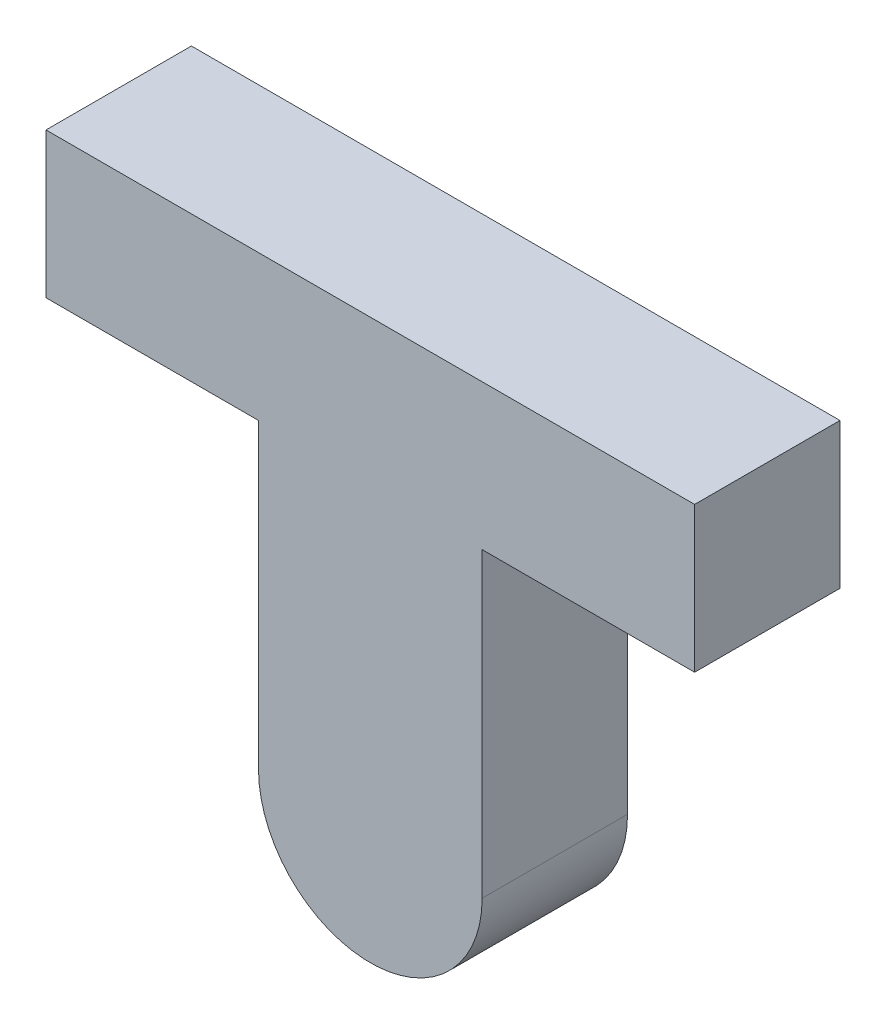
ISO-10303-21;
HEADER;
FILE_DESCRIPTION(('STEP AP214'),'2;1');
FILE_NAME('part.step','',(''),(''),'','','');
FILE_SCHEMA(('AUTOMOTIVE_DESIGN { 1 0 10303 214 1 1 1 1 }'));
ENDSEC;
DATA;
#1=APPLICATION_CONTEXT('core data for automotive mechanical design processes');
#2=APPLICATION_PROTOCOL_DEFINITION('international standard','automotive_design',2000,#1);
#3=PRODUCT_CONTEXT('',#1,'mechanical');
#4=PRODUCT('Part','Part','',(#3));
#5=PRODUCT_RELATED_PRODUCT_CATEGORY('part','',(#4));
#6=PRODUCT_DEFINITION_FORMATION('','',#4);
#7=PRODUCT_DEFINITION_CONTEXT('part definition',#1,'design');
#8=PRODUCT_DEFINITION('design','',#6,#7);
#9=PRODUCT_DEFINITION_SHAPE('','',#8);
#10=(LENGTH_UNIT() NAMED_UNIT(*) SI_UNIT(.MILLI.,.METRE.));
#11=(NAMED_UNIT(*) PLANE_ANGLE_UNIT() SI_UNIT($,.RADIAN.));
#12=(NAMED_UNIT(*) SI_UNIT($,.STERADIAN.) SOLID_ANGLE_UNIT());
#13=UNCERTAINTY_MEASURE_WITH_UNIT(LENGTH_MEASURE(1.E-05),#10,'distance_accuracy_value','');
#14=(GEOMETRIC_REPRESENTATION_CONTEXT(3) GLOBAL_UNCERTAINTY_ASSIGNED_CONTEXT((#13)) GLOBAL_UNIT_ASSIGNED_CONTEXT((#10,
#11,#12)) REPRESENTATION_CONTEXT('',''));
#15=CARTESIAN_POINT('',(0.,0.,0.));
#16=DIRECTION('',(0.,0.,1.));
#17=DIRECTION('',(1.,0.,0.));
#18=AXIS2_PLACEMENT_3D('',#15,#16,#17);
#19=CARTESIAN_POINT('',(0.,0.,0.65));
#20=DIRECTION('',(0.,0.,-1.));
#21=DIRECTION('',(-1.,0.,0.));
#22=AXIS2_PLACEMENT_3D('',#19,#20,#21);
#23=CYLINDRICAL_SURFACE('',#22,1.);
#24=CARTESIAN_POINT('',(0.,0.,-0.65));
#25=DIRECTION('',(0.,0.,1.));
#26=DIRECTION('',(1.,0.,0.));
#27=AXIS2_PLACEMENT_3D('',#24,#25,#26);
#28=CIRCLE('',#27,1.);
#29=CARTESIAN_POINT('',(-1.,0.,-0.65));
#30=VERTEX_POINT('',#29);
#31=CARTESIAN_POINT('',(1.,0.,-0.65));
#32=VERTEX_POINT('',#31);
#33=EDGE_CURVE('E146',#30,#32,#28,.T.);
#34=ORIENTED_EDGE('',*,*,#33,.T.);
#35=DIRECTION('',(0.,0.,-1.));
#36=VECTOR('',#35,1.);
#37=CARTESIAN_POINT('',(1.,0.,0.65));
#38=LINE('',#37,#36);
#39=CARTESIAN_POINT('',(1.,0.,0.65));
#40=VERTEX_POINT('',#39);
#41=EDGE_CURVE('E11',#40,#32,#38,.T.);
#42=ORIENTED_EDGE('',*,*,#41,.F.);
#43=CARTESIAN_POINT('',(0.,0.,0.65));
#44=DIRECTION('',(0.,0.,1.));
#45=DIRECTION('',(1.,0.,0.));
#46=AXIS2_PLACEMENT_3D('',#43,#44,#45);
#47=CIRCLE('',#46,1.);
#48=CARTESIAN_POINT('',(-1.,0.,0.65));
#49=VERTEX_POINT('',#48);
#50=EDGE_CURVE('E168',#49,#40,#47,.T.);
#51=ORIENTED_EDGE('',*,*,#50,.F.);
#52=DIRECTION('',(0.,0.,-1.));
#53=VECTOR('',#52,1.);
#54=CARTESIAN_POINT('',(-1.,0.,0.65));
#55=LINE('',#54,#53);
#56=EDGE_CURVE('E142',#49,#30,#55,.T.);
#57=ORIENTED_EDGE('',*,*,#56,.T.);
#58=EDGE_LOOP('',(#34,#42,#51,#57));
#59=FACE_BOUND('',#58,.T.);
#60=ADVANCED_FACE('F45',(#59),#23,.T.);
#61=CARTESIAN_POINT('',(1.,2.7,0.65));
#62=DIRECTION('',(-1.,0.,0.));
#63=DIRECTION('',(0.,0.,1.));
#64=AXIS2_PLACEMENT_3D('',#61,#62,#63);
#65=PLANE('',#64);
#66=DIRECTION('',(0.,1.,0.));
#67=VECTOR('',#66,1.);
#68=CARTESIAN_POINT('',(1.,2.7,-0.65));
#69=LINE('',#68,#67);
#70=CARTESIAN_POINT('',(1.,2.7,-0.65));
#71=VERTEX_POINT('',#70);
#72=EDGE_CURVE('E150',#32,#71,#69,.T.);
#73=ORIENTED_EDGE('',*,*,#72,.T.);
#74=DIRECTION('',(0.,0.,-1.));
#75=VECTOR('',#74,1.);
#76=CARTESIAN_POINT('',(1.,2.7,0.65));
#77=LINE('',#76,#75);
#78=CARTESIAN_POINT('',(1.,2.7,0.65));
#79=VERTEX_POINT('',#78);
#80=EDGE_CURVE('E54',#79,#71,#77,.T.);
#81=ORIENTED_EDGE('',*,*,#80,.F.);
#82=DIRECTION('',(0.,1.,0.));
#83=VECTOR('',#82,1.);
#84=CARTESIAN_POINT('',(1.,2.7,0.65));
#85=LINE('',#84,#83);
#86=EDGE_CURVE('E105',#40,#79,#85,.T.);
#87=ORIENTED_EDGE('',*,*,#86,.F.);
#88=ORIENTED_EDGE('',*,*,#41,.T.);
#89=EDGE_LOOP('',(#73,#81,#87,#88));
#90=FACE_BOUND('',#89,.T.);
#91=ADVANCED_FACE('F214',(#90),#65,.F.);
#92=CARTESIAN_POINT('',(1.,2.7,0.65));
#93=DIRECTION('',(0.,1.,0.));
#94=DIRECTION('',(0.,0.,1.));
#95=AXIS2_PLACEMENT_3D('',#92,#93,#94);
#96=PLANE('',#95);
#97=DIRECTION('',(1.,0.,0.));
#98=VECTOR('',#97,1.);
#99=CARTESIAN_POINT('',(1.,2.7,-0.65));
#100=LINE('',#99,#98);
#101=CARTESIAN_POINT('',(2.9,2.7,-0.65));
#102=VERTEX_POINT('',#101);
#103=EDGE_CURVE('E153',#71,#102,#100,.T.);
#104=ORIENTED_EDGE('',*,*,#103,.T.);
#105=DIRECTION('',(0.,0.,-1.));
#106=VECTOR('',#105,1.);
#107=CARTESIAN_POINT('',(2.9,2.7,0.65));
#108=LINE('',#107,#106);
#109=CARTESIAN_POINT('',(2.9,2.7,0.65));
#110=VERTEX_POINT('',#109);
#111=EDGE_CURVE('E179',#110,#102,#108,.T.);
#112=ORIENTED_EDGE('',*,*,#111,.F.);
#113=DIRECTION('',(1.,0.,0.));
#114=VECTOR('',#113,1.);
#115=CARTESIAN_POINT('',(1.,2.7,0.65));
#116=LINE('',#115,#114);
#117=EDGE_CURVE('E189',#79,#110,#116,.T.);
#118=ORIENTED_EDGE('',*,*,#117,.F.);
#119=ORIENTED_EDGE('',*,*,#80,.T.);
#120=EDGE_LOOP('',(#104,#112,#118,#119));
#121=FACE_BOUND('',#120,.T.);
#122=ADVANCED_FACE('F187',(#121),#96,.F.);
#123=CARTESIAN_POINT('',(2.9,4.,0.65));
#124=DIRECTION('',(-1.,0.,0.));
#125=DIRECTION('',(0.,0.,1.));
#126=AXIS2_PLACEMENT_3D('',#123,#124,#125);
#127=PLANE('',#126);
#128=DIRECTION('',(0.,1.,0.));
#129=VECTOR('',#128,1.);
#130=CARTESIAN_POINT('',(2.9,4.,-0.65));
#131=LINE('',#130,#129);
#132=CARTESIAN_POINT('',(2.9,4.,-0.65));
#133=VERTEX_POINT('',#132);
#134=EDGE_CURVE('E156',#102,#133,#131,.T.);
#135=ORIENTED_EDGE('',*,*,#134,.T.);
#136=DIRECTION('',(0.,0.,-1.));
#137=VECTOR('',#136,1.);
#138=CARTESIAN_POINT('',(2.9,4.,0.65));
#139=LINE('',#138,#137);
#140=CARTESIAN_POINT('',(2.9,4.,0.65));
#141=VERTEX_POINT('',#140);
#142=EDGE_CURVE('E175',#141,#133,#139,.T.);
#143=ORIENTED_EDGE('',*,*,#142,.F.);
#144=DIRECTION('',(0.,1.,0.));
#145=VECTOR('',#144,1.);
#146=CARTESIAN_POINT('',(2.9,4.,0.65));
#147=LINE('',#146,#145);
#148=EDGE_CURVE('E202',#110,#141,#147,.T.);
#149=ORIENTED_EDGE('',*,*,#148,.F.);
#150=ORIENTED_EDGE('',*,*,#111,.T.);
#151=EDGE_LOOP('',(#135,#143,#149,#150));
#152=FACE_BOUND('',#151,.T.);
#153=ADVANCED_FACE('F197',(#152),#127,.F.);
#154=CARTESIAN_POINT('',(-2.9,4.,0.65));
#155=DIRECTION('',(0.,-1.,0.));
#156=DIRECTION('',(0.,0.,-1.));
#157=AXIS2_PLACEMENT_3D('',#154,#155,#156);
#158=PLANE('',#157);
#159=DIRECTION('',(-1.,0.,0.));
#160=VECTOR('',#159,1.);
#161=CARTESIAN_POINT('',(-2.9,4.,-0.65));
#162=LINE('',#161,#160);
#163=CARTESIAN_POINT('',(-2.9,4.,-0.65));
#164=VERTEX_POINT('',#163);
#165=EDGE_CURVE('E159',#133,#164,#162,.T.);
#166=ORIENTED_EDGE('',*,*,#165,.T.);
#167=DIRECTION('',(0.,0.,-1.));
#168=VECTOR('',#167,1.);
#169=CARTESIAN_POINT('',(-2.9,4.,0.65));
#170=LINE('',#169,#168);
#171=CARTESIAN_POINT('',(-2.9,4.,0.65));
#172=VERTEX_POINT('',#171);
#173=EDGE_CURVE('E135',#172,#164,#170,.T.);
#174=ORIENTED_EDGE('',*,*,#173,.F.);
#175=DIRECTION('',(-1.,0.,0.));
#176=VECTOR('',#175,1.);
#177=CARTESIAN_POINT('',(-2.9,4.,0.65));
#178=LINE('',#177,#176);
#179=EDGE_CURVE('E124',#141,#172,#178,.T.);
#180=ORIENTED_EDGE('',*,*,#179,.F.);
#181=ORIENTED_EDGE('',*,*,#142,.T.);
#182=EDGE_LOOP('',(#166,#174,#180,#181));
#183=FACE_BOUND('',#182,.T.);
#184=ADVANCED_FACE('F200',(#183),#158,.F.);
#185=CARTESIAN_POINT('',(-2.9,4.,0.65));
#186=DIRECTION('',(1.,0.,0.));
#187=DIRECTION('',(0.,0.,-1.));
#188=AXIS2_PLACEMENT_3D('',#185,#186,#187);
#189=PLANE('',#188);
#190=DIRECTION('',(0.,-1.,0.));
#191=VECTOR('',#190,1.);
#192=CARTESIAN_POINT('',(-2.9,4.,-0.65));
#193=LINE('',#192,#191);
#194=CARTESIAN_POINT('',(-2.9,2.7,-0.65));
#195=VERTEX_POINT('',#194);
#196=EDGE_CURVE('E133',#164,#195,#193,.T.);
#197=ORIENTED_EDGE('',*,*,#196,.T.);
#198=DIRECTION('',(0.,0.,-1.));
#199=VECTOR('',#198,1.);
#200=CARTESIAN_POINT('',(-2.9,2.7,0.65));
#201=LINE('',#200,#199);
#202=CARTESIAN_POINT('',(-2.9,2.7,0.65));
#203=VERTEX_POINT('',#202);
#204=EDGE_CURVE('E130',#203,#195,#201,.T.);
#205=ORIENTED_EDGE('',*,*,#204,.F.);
#206=DIRECTION('',(0.,-1.,0.));
#207=VECTOR('',#206,1.);
#208=CARTESIAN_POINT('',(-2.9,4.,0.65));
#209=LINE('',#208,#207);
#210=EDGE_CURVE('E118',#172,#203,#209,.T.);
#211=ORIENTED_EDGE('',*,*,#210,.F.);
#212=ORIENTED_EDGE('',*,*,#173,.T.);
#213=EDGE_LOOP('',(#197,#205,#211,#212));
#214=FACE_BOUND('',#213,.T.);
#215=ADVANCED_FACE('F131',(#214),#189,.F.);
#216=CARTESIAN_POINT('',(-2.9,2.7,0.65));
#217=DIRECTION('',(0.,1.,0.));
#218=DIRECTION('',(0.,0.,1.));
#219=AXIS2_PLACEMENT_3D('',#216,#217,#218);
#220=PLANE('',#219);
#221=DIRECTION('',(1.,0.,0.));
#222=VECTOR('',#221,1.);
#223=CARTESIAN_POINT('',(-2.9,2.7,-0.65));
#224=LINE('',#223,#222);
#225=CARTESIAN_POINT('',(-1.,2.7,-0.65));
#226=VERTEX_POINT('',#225);
#227=EDGE_CURVE('E91',#195,#226,#224,.T.);
#228=ORIENTED_EDGE('',*,*,#227,.T.);
#229=DIRECTION('',(0.,0.,-1.));
#230=VECTOR('',#229,1.);
#231=CARTESIAN_POINT('',(-1.,2.7,0.65));
#232=LINE('',#231,#230);
#233=CARTESIAN_POINT('',(-1.,2.7,0.65));
#234=VERTEX_POINT('',#233);
#235=EDGE_CURVE('E136',#234,#226,#232,.T.);
#236=ORIENTED_EDGE('',*,*,#235,.F.);
#237=DIRECTION('',(1.,0.,0.));
#238=VECTOR('',#237,1.);
#239=CARTESIAN_POINT('',(-2.9,2.7,0.65));
#240=LINE('',#239,#238);
#241=EDGE_CURVE('E122',#203,#234,#240,.T.);
#242=ORIENTED_EDGE('',*,*,#241,.F.);
#243=ORIENTED_EDGE('',*,*,#204,.T.);
#244=EDGE_LOOP('',(#228,#236,#242,#243));
#245=FACE_BOUND('',#244,.T.);
#246=ADVANCED_FACE('F138',(#245),#220,.F.);
#247=CARTESIAN_POINT('',(-1.,2.7,0.65));
#248=DIRECTION('',(1.,0.,0.));
#249=DIRECTION('',(0.,1.,0.));
#250=AXIS2_PLACEMENT_3D('',#247,#248,#249);
#251=PLANE('',#250);
#252=DIRECTION('',(0.,-1.,0.));
#253=VECTOR('',#252,1.);
#254=CARTESIAN_POINT('',(-1.,2.7,-0.65));
#255=LINE('',#254,#253);
#256=EDGE_CURVE('E97',#226,#30,#255,.T.);
#257=ORIENTED_EDGE('',*,*,#256,.T.);
#258=ORIENTED_EDGE('',*,*,#56,.F.);
#259=DIRECTION('',(0.,-1.,0.));
#260=VECTOR('',#259,1.);
#261=CARTESIAN_POINT('',(-1.,2.7,0.65));
#262=LINE('',#261,#260);
#263=EDGE_CURVE('E62',#234,#49,#262,.T.);
#264=ORIENTED_EDGE('',*,*,#263,.F.);
#265=ORIENTED_EDGE('',*,*,#235,.T.);
#266=EDGE_LOOP('',(#257,#258,#264,#265));
#267=FACE_BOUND('',#266,.T.);
#268=ADVANCED_FACE('F230',(#267),#251,.F.);
#269=CARTESIAN_POINT('',(0.,0.,0.65));
#270=DIRECTION('',(0.,0.,1.));
#271=DIRECTION('',(1.,0.,0.));
#272=AXIS2_PLACEMENT_3D('',#269,#270,#271);
#273=PLANE('',#272);
#274=ORIENTED_EDGE('',*,*,#50,.T.);
#275=ORIENTED_EDGE('',*,*,#86,.T.);
#276=ORIENTED_EDGE('',*,*,#117,.T.);
#277=ORIENTED_EDGE('',*,*,#148,.T.);
#278=ORIENTED_EDGE('',*,*,#179,.T.);
#279=ORIENTED_EDGE('',*,*,#210,.T.);
#280=ORIENTED_EDGE('',*,*,#241,.T.);
#281=ORIENTED_EDGE('',*,*,#263,.T.);
#282=EDGE_LOOP('',(#274,#275,#276,#277,#278,#279,#280,#281));
#283=FACE_BOUND('',#282,.T.);
#284=ADVANCED_FACE('F120',(#283),#273,.T.);
#285=CARTESIAN_POINT('',(0.,0.,-0.65));
#286=DIRECTION('',(0.,0.,1.));
#287=DIRECTION('',(1.,0.,0.));
#288=AXIS2_PLACEMENT_3D('',#285,#286,#287);
#289=PLANE('',#288);
#290=ORIENTED_EDGE('',*,*,#33,.F.);
#291=ORIENTED_EDGE('',*,*,#256,.F.);
#292=ORIENTED_EDGE('',*,*,#227,.F.);
#293=ORIENTED_EDGE('',*,*,#196,.F.);
#294=ORIENTED_EDGE('',*,*,#165,.F.);
#295=ORIENTED_EDGE('',*,*,#134,.F.);
#296=ORIENTED_EDGE('',*,*,#103,.F.);
#297=ORIENTED_EDGE('',*,*,#72,.F.);
#298=EDGE_LOOP('',(#290,#291,#292,#293,#294,#295,#296,#297));
#299=FACE_BOUND('',#298,.T.);
#300=ADVANCED_FACE('F193',(#299),#289,.F.);
#301=CLOSED_SHELL('',(#60,#91,#122,#153,#184,#215,#246,#268,#284,#300));
#302=MANIFOLD_SOLID_BREP('B2',#301);
#303=ADVANCED_BREP_SHAPE_REPRESENTATION('',(#18,#302),#14);
#304=SHAPE_DEFINITION_REPRESENTATION(#9,#303);
ENDSEC;
END-ISO-10303-21;
